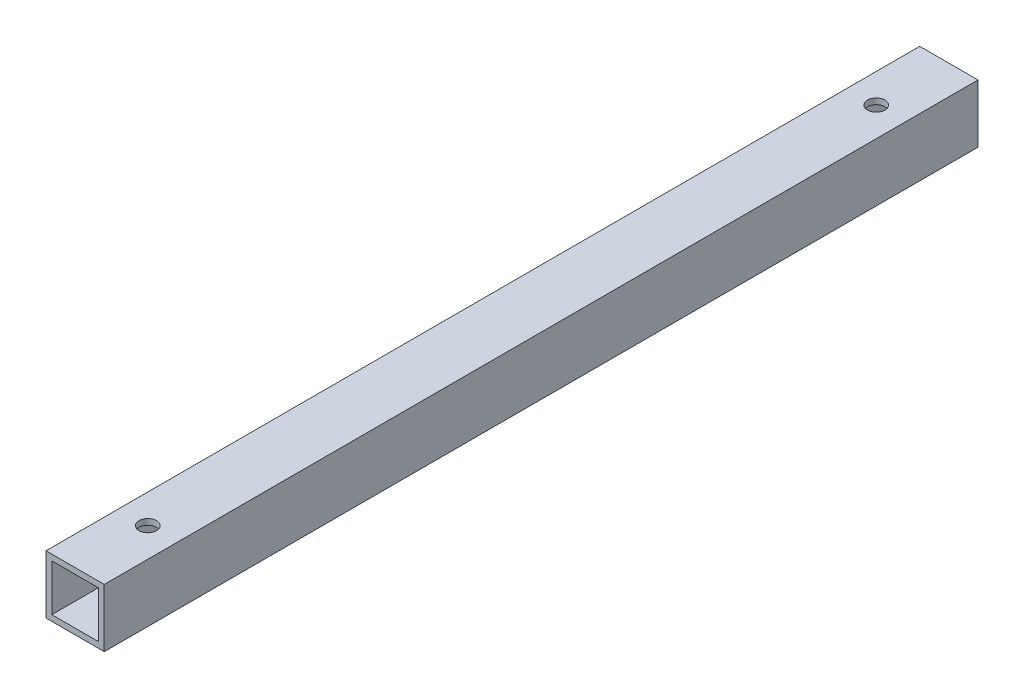
ISO-10303-21;
HEADER;
FILE_DESCRIPTION(('STEP AP214'),'2;1');
FILE_NAME('part.step','',(''),(''),'','','');
FILE_SCHEMA(('AUTOMOTIVE_DESIGN { 1 0 10303 214 1 1 1 1 }'));
ENDSEC;
DATA;
#1=APPLICATION_CONTEXT('core data for automotive mechanical design processes');
#2=APPLICATION_PROTOCOL_DEFINITION('international standard','automotive_design',2000,#1);
#3=PRODUCT_CONTEXT('',#1,'mechanical');
#4=PRODUCT('Part','Part','',(#3));
#5=PRODUCT_RELATED_PRODUCT_CATEGORY('part','',(#4));
#6=PRODUCT_DEFINITION_FORMATION('','',#4);
#7=PRODUCT_DEFINITION_CONTEXT('part definition',#1,'design');
#8=PRODUCT_DEFINITION('design','',#6,#7);
#9=PRODUCT_DEFINITION_SHAPE('','',#8);
#10=(LENGTH_UNIT() NAMED_UNIT(*) SI_UNIT(.MILLI.,.METRE.));
#11=(NAMED_UNIT(*) PLANE_ANGLE_UNIT() SI_UNIT($,.RADIAN.));
#12=(NAMED_UNIT(*) SI_UNIT($,.STERADIAN.) SOLID_ANGLE_UNIT());
#13=UNCERTAINTY_MEASURE_WITH_UNIT(LENGTH_MEASURE(1.E-05),#10,'distance_accuracy_value','');
#14=(GEOMETRIC_REPRESENTATION_CONTEXT(3) GLOBAL_UNCERTAINTY_ASSIGNED_CONTEXT((#13)) GLOBAL_UNIT_ASSIGNED_CONTEXT((#10,
#11,#12)) REPRESENTATION_CONTEXT('',''));
#15=CARTESIAN_POINT('',(0.,0.,0.));
#16=DIRECTION('',(0.,0.,1.));
#17=DIRECTION('',(1.,0.,0.));
#18=AXIS2_PLACEMENT_3D('',#15,#16,#17);
#19=CARTESIAN_POINT('',(0.,0.,75.));
#20=DIRECTION('',(0.,0.,-1.));
#21=DIRECTION('',(-1.,0.,0.));
#22=AXIS2_PLACEMENT_3D('',#19,#20,#21);
#23=PLANE('',#22);
#24=DIRECTION('',(0.,-1.,0.));
#25=VECTOR('',#24,1.);
#26=CARTESIAN_POINT('',(-5.,5.,75.));
#27=LINE('',#26,#25);
#28=CARTESIAN_POINT('',(-5.,5.,75.));
#29=VERTEX_POINT('',#28);
#30=CARTESIAN_POINT('',(-5.,-5.,75.));
#31=VERTEX_POINT('',#30);
#32=EDGE_CURVE('E139',#29,#31,#27,.T.);
#33=ORIENTED_EDGE('',*,*,#32,.T.);
#34=DIRECTION('',(1.,0.,0.));
#35=VECTOR('',#34,1.);
#36=CARTESIAN_POINT('',(5.,-5.,75.));
#37=LINE('',#36,#35);
#38=CARTESIAN_POINT('',(5.,-5.,75.));
#39=VERTEX_POINT('',#38);
#40=EDGE_CURVE('E142',#31,#39,#37,.T.);
#41=ORIENTED_EDGE('',*,*,#40,.T.);
#42=DIRECTION('',(0.,1.,0.));
#43=VECTOR('',#42,1.);
#44=CARTESIAN_POINT('',(5.,5.,75.));
#45=LINE('',#44,#43);
#46=CARTESIAN_POINT('',(5.,5.,75.));
#47=VERTEX_POINT('',#46);
#48=EDGE_CURVE('E145',#39,#47,#45,.T.);
#49=ORIENTED_EDGE('',*,*,#48,.T.);
#50=DIRECTION('',(-1.,0.,0.));
#51=VECTOR('',#50,1.);
#52=CARTESIAN_POINT('',(5.,5.,75.));
#53=LINE('',#52,#51);
#54=EDGE_CURVE('E147',#47,#29,#53,.T.);
#55=ORIENTED_EDGE('',*,*,#54,.T.);
#56=EDGE_LOOP('',(#33,#41,#49,#55));
#57=FACE_BOUND('',#56,.T.);
#58=DIRECTION('',(0.,-1.,0.));
#59=VECTOR('',#58,1.);
#60=CARTESIAN_POINT('',(-4.,4.,75.));
#61=LINE('',#60,#59);
#62=CARTESIAN_POINT('',(-4.,4.,75.));
#63=VERTEX_POINT('',#62);
#64=CARTESIAN_POINT('',(-4.,-4.,75.));
#65=VERTEX_POINT('',#64);
#66=EDGE_CURVE('E101',#63,#65,#61,.T.);
#67=ORIENTED_EDGE('',*,*,#66,.F.);
#68=DIRECTION('',(-1.,0.,0.));
#69=VECTOR('',#68,1.);
#70=CARTESIAN_POINT('',(4.,4.,75.));
#71=LINE('',#70,#69);
#72=CARTESIAN_POINT('',(4.,4.,75.));
#73=VERTEX_POINT('',#72);
#74=EDGE_CURVE('E123',#73,#63,#71,.T.);
#75=ORIENTED_EDGE('',*,*,#74,.F.);
#76=DIRECTION('',(0.,1.,0.));
#77=VECTOR('',#76,1.);
#78=CARTESIAN_POINT('',(4.,4.,75.));
#79=LINE('',#78,#77);
#80=CARTESIAN_POINT('',(4.,-4.,75.));
#81=VERTEX_POINT('',#80);
#82=EDGE_CURVE('E121',#81,#73,#79,.T.);
#83=ORIENTED_EDGE('',*,*,#82,.F.);
#84=DIRECTION('',(1.,0.,0.));
#85=VECTOR('',#84,1.);
#86=CARTESIAN_POINT('',(4.,-4.,75.));
#87=LINE('',#86,#85);
#88=EDGE_CURVE('E109',#65,#81,#87,.T.);
#89=ORIENTED_EDGE('',*,*,#88,.F.);
#90=EDGE_LOOP('',(#67,#75,#83,#89));
#91=FACE_BOUND('',#90,.T.);
#92=ADVANCED_FACE('F35',(#57,#91),#23,.F.);
#93=CARTESIAN_POINT('',(0.,0.,-75.));
#94=DIRECTION('',(0.,0.,-1.));
#95=DIRECTION('',(-1.,0.,0.));
#96=AXIS2_PLACEMENT_3D('',#93,#94,#95);
#97=PLANE('',#96);
#98=DIRECTION('',(0.,-1.,0.));
#99=VECTOR('',#98,1.);
#100=CARTESIAN_POINT('',(-5.,5.,-75.));
#101=LINE('',#100,#99);
#102=CARTESIAN_POINT('',(-5.,5.,-75.));
#103=VERTEX_POINT('',#102);
#104=CARTESIAN_POINT('',(-5.,-5.,-75.));
#105=VERTEX_POINT('',#104);
#106=EDGE_CURVE('E117',#103,#105,#101,.T.);
#107=ORIENTED_EDGE('',*,*,#106,.F.);
#108=DIRECTION('',(-1.,0.,0.));
#109=VECTOR('',#108,1.);
#110=CARTESIAN_POINT('',(5.,5.,-75.));
#111=LINE('',#110,#109);
#112=CARTESIAN_POINT('',(5.,5.,-75.));
#113=VERTEX_POINT('',#112);
#114=EDGE_CURVE('E143',#113,#103,#111,.T.);
#115=ORIENTED_EDGE('',*,*,#114,.F.);
#116=DIRECTION('',(0.,1.,0.));
#117=VECTOR('',#116,1.);
#118=CARTESIAN_POINT('',(5.,5.,-75.));
#119=LINE('',#118,#117);
#120=CARTESIAN_POINT('',(5.,-5.,-75.));
#121=VERTEX_POINT('',#120);
#122=EDGE_CURVE('E154',#121,#113,#119,.T.);
#123=ORIENTED_EDGE('',*,*,#122,.F.);
#124=DIRECTION('',(1.,0.,0.));
#125=VECTOR('',#124,1.);
#126=CARTESIAN_POINT('',(5.,-5.,-75.));
#127=LINE('',#126,#125);
#128=EDGE_CURVE('E152',#105,#121,#127,.T.);
#129=ORIENTED_EDGE('',*,*,#128,.F.);
#130=EDGE_LOOP('',(#107,#115,#123,#129));
#131=FACE_BOUND('',#130,.T.);
#132=DIRECTION('',(-1.,0.,0.));
#133=VECTOR('',#132,1.);
#134=CARTESIAN_POINT('',(4.,4.,-75.));
#135=LINE('',#134,#133);
#136=CARTESIAN_POINT('',(4.,4.,-75.));
#137=VERTEX_POINT('',#136);
#138=CARTESIAN_POINT('',(-4.,4.,-75.));
#139=VERTEX_POINT('',#138);
#140=EDGE_CURVE('E110',#137,#139,#135,.T.);
#141=ORIENTED_EDGE('',*,*,#140,.T.);
#142=DIRECTION('',(0.,-1.,0.));
#143=VECTOR('',#142,1.);
#144=CARTESIAN_POINT('',(-4.,4.,-75.));
#145=LINE('',#144,#143);
#146=CARTESIAN_POINT('',(-4.,-4.,-75.));
#147=VERTEX_POINT('',#146);
#148=EDGE_CURVE('E59',#139,#147,#145,.T.);
#149=ORIENTED_EDGE('',*,*,#148,.T.);
#150=DIRECTION('',(1.,0.,0.));
#151=VECTOR('',#150,1.);
#152=CARTESIAN_POINT('',(4.,-4.,-75.));
#153=LINE('',#152,#151);
#154=CARTESIAN_POINT('',(4.,-4.,-75.));
#155=VERTEX_POINT('',#154);
#156=EDGE_CURVE('E116',#147,#155,#153,.T.);
#157=ORIENTED_EDGE('',*,*,#156,.T.);
#158=DIRECTION('',(0.,1.,0.));
#159=VECTOR('',#158,1.);
#160=CARTESIAN_POINT('',(4.,4.,-75.));
#161=LINE('',#160,#159);
#162=EDGE_CURVE('E131',#155,#137,#161,.T.);
#163=ORIENTED_EDGE('',*,*,#162,.T.);
#164=EDGE_LOOP('',(#141,#149,#157,#163));
#165=FACE_BOUND('',#164,.T.);
#166=ADVANCED_FACE('F173',(#131,#165),#97,.T.);
#167=CARTESIAN_POINT('',(-5.,5.,75.));
#168=DIRECTION('',(1.,0.,0.));
#169=DIRECTION('',(0.,0.,-1.));
#170=AXIS2_PLACEMENT_3D('',#167,#168,#169);
#171=PLANE('',#170);
#172=ORIENTED_EDGE('',*,*,#106,.T.);
#173=DIRECTION('',(0.,0.,-1.));
#174=VECTOR('',#173,1.);
#175=CARTESIAN_POINT('',(-5.,-5.,75.));
#176=LINE('',#175,#174);
#177=EDGE_CURVE('E11',#31,#105,#176,.T.);
#178=ORIENTED_EDGE('',*,*,#177,.F.);
#179=ORIENTED_EDGE('',*,*,#32,.F.);
#180=DIRECTION('',(0.,0.,-1.));
#181=VECTOR('',#180,1.);
#182=CARTESIAN_POINT('',(-5.,5.,75.));
#183=LINE('',#182,#181);
#184=EDGE_CURVE('E149',#29,#103,#183,.T.);
#185=ORIENTED_EDGE('',*,*,#184,.T.);
#186=EDGE_LOOP('',(#172,#178,#179,#185));
#187=FACE_BOUND('',#186,.T.);
#188=ADVANCED_FACE('F37',(#187),#171,.F.);
#189=CARTESIAN_POINT('',(5.,-5.,75.));
#190=DIRECTION('',(0.,1.,0.));
#191=DIRECTION('',(0.,0.,1.));
#192=AXIS2_PLACEMENT_3D('',#189,#190,#191);
#193=PLANE('',#192);
#194=CARTESIAN_POINT('',(0.00163858329448041,-5.,62.5223109153456));
#195=DIRECTION('',(0.,-1.,0.));
#196=DIRECTION('',(0.,0.,-1.));
#197=AXIS2_PLACEMENT_3D('',#194,#195,#196);
#198=CIRCLE('',#197,1.50000000000001);
#199=CARTESIAN_POINT('',(0.00163858329448041,-5.,61.0223109153456));
#200=VERTEX_POINT('',#199);
#201=EDGE_CURVE('E260',#200,#200,#198,.T.);
#202=ORIENTED_EDGE('',*,*,#201,.F.);
#203=EDGE_LOOP('',(#202));
#204=FACE_BOUND('',#203,.T.);
#205=CARTESIAN_POINT('',(0.00163858327670297,-5.,-62.5295779221826));
#206=DIRECTION('',(0.,-1.,0.));
#207=DIRECTION('',(0.,0.,-1.));
#208=AXIS2_PLACEMENT_3D('',#205,#206,#207);
#209=CIRCLE('',#208,1.50000000000001);
#210=CARTESIAN_POINT('',(0.00163858327670297,-5.,-64.0295779221826));
#211=VERTEX_POINT('',#210);
#212=EDGE_CURVE('E218',#211,#211,#209,.T.);
#213=ORIENTED_EDGE('',*,*,#212,.F.);
#214=EDGE_LOOP('',(#213));
#215=FACE_BOUND('',#214,.T.);
#216=ORIENTED_EDGE('',*,*,#128,.T.);
#217=DIRECTION('',(0.,0.,-1.));
#218=VECTOR('',#217,1.);
#219=CARTESIAN_POINT('',(5.,-5.,75.));
#220=LINE('',#219,#218);
#221=EDGE_CURVE('E44',#39,#121,#220,.T.);
#222=ORIENTED_EDGE('',*,*,#221,.F.);
#223=ORIENTED_EDGE('',*,*,#40,.F.);
#224=ORIENTED_EDGE('',*,*,#177,.T.);
#225=EDGE_LOOP('',(#216,#222,#223,#224));
#226=FACE_BOUND('',#225,.T.);
#227=ADVANCED_FACE('F183',(#204,#215,#226),#193,.F.);
#228=CARTESIAN_POINT('',(5.,5.,75.));
#229=DIRECTION('',(-1.,0.,0.));
#230=DIRECTION('',(0.,0.,1.));
#231=AXIS2_PLACEMENT_3D('',#228,#229,#230);
#232=PLANE('',#231);
#233=ORIENTED_EDGE('',*,*,#122,.T.);
#234=DIRECTION('',(0.,0.,-1.));
#235=VECTOR('',#234,1.);
#236=CARTESIAN_POINT('',(5.,5.,75.));
#237=LINE('',#236,#235);
#238=EDGE_CURVE('E159',#47,#113,#237,.T.);
#239=ORIENTED_EDGE('',*,*,#238,.F.);
#240=ORIENTED_EDGE('',*,*,#48,.F.);
#241=ORIENTED_EDGE('',*,*,#221,.T.);
#242=EDGE_LOOP('',(#233,#239,#240,#241));
#243=FACE_BOUND('',#242,.T.);
#244=ADVANCED_FACE('F167',(#243),#232,.F.);
#245=CARTESIAN_POINT('',(5.,5.,75.));
#246=DIRECTION('',(0.,-1.,0.));
#247=DIRECTION('',(1.,0.,0.));
#248=AXIS2_PLACEMENT_3D('',#245,#246,#247);
#249=PLANE('',#248);
#250=CARTESIAN_POINT('',(0.00163858329448041,5.,62.5223109153456));
#251=DIRECTION('',(0.,-1.,0.));
#252=DIRECTION('',(0.,0.,-1.));
#253=AXIS2_PLACEMENT_3D('',#250,#251,#252);
#254=CIRCLE('',#253,1.50000000000001);
#255=CARTESIAN_POINT('',(0.00163858329448041,5.,61.0223109153456));
#256=VERTEX_POINT('',#255);
#257=EDGE_CURVE('E212',#256,#256,#254,.T.);
#258=ORIENTED_EDGE('',*,*,#257,.T.);
#259=EDGE_LOOP('',(#258));
#260=FACE_BOUND('',#259,.T.);
#261=CARTESIAN_POINT('',(0.00163858327670297,5.,-62.5295779221826));
#262=DIRECTION('',(0.,-1.,0.));
#263=DIRECTION('',(0.,0.,-1.));
#264=AXIS2_PLACEMENT_3D('',#261,#262,#263);
#265=CIRCLE('',#264,1.50000000000001);
#266=CARTESIAN_POINT('',(0.00163858327670297,5.,-64.0295779221826));
#267=VERTEX_POINT('',#266);
#268=EDGE_CURVE('E215',#267,#267,#265,.T.);
#269=ORIENTED_EDGE('',*,*,#268,.T.);
#270=EDGE_LOOP('',(#269));
#271=FACE_BOUND('',#270,.T.);
#272=ORIENTED_EDGE('',*,*,#114,.T.);
#273=ORIENTED_EDGE('',*,*,#184,.F.);
#274=ORIENTED_EDGE('',*,*,#54,.F.);
#275=ORIENTED_EDGE('',*,*,#238,.T.);
#276=EDGE_LOOP('',(#272,#273,#274,#275));
#277=FACE_BOUND('',#276,.T.);
#278=ADVANCED_FACE('F177',(#260,#271,#277),#249,.F.);
#279=CARTESIAN_POINT('',(-4.,4.,75.));
#280=DIRECTION('',(1.,0.,0.));
#281=DIRECTION('',(0.,0.,-1.));
#282=AXIS2_PLACEMENT_3D('',#279,#280,#281);
#283=PLANE('',#282);
#284=ORIENTED_EDGE('',*,*,#148,.F.);
#285=DIRECTION('',(0.,0.,-1.));
#286=VECTOR('',#285,1.);
#287=CARTESIAN_POINT('',(-4.,4.,75.));
#288=LINE('',#287,#286);
#289=EDGE_CURVE('E105',#63,#139,#288,.T.);
#290=ORIENTED_EDGE('',*,*,#289,.F.);
#291=ORIENTED_EDGE('',*,*,#66,.T.);
#292=DIRECTION('',(0.,0.,-1.));
#293=VECTOR('',#292,1.);
#294=CARTESIAN_POINT('',(-4.,-4.,75.));
#295=LINE('',#294,#293);
#296=EDGE_CURVE('E104',#65,#147,#295,.T.);
#297=ORIENTED_EDGE('',*,*,#296,.T.);
#298=EDGE_LOOP('',(#284,#290,#291,#297));
#299=FACE_BOUND('',#298,.T.);
#300=ADVANCED_FACE('F103',(#299),#283,.T.);
#301=CARTESIAN_POINT('',(4.,-4.,75.));
#302=DIRECTION('',(0.,1.,0.));
#303=DIRECTION('',(0.,0.,1.));
#304=AXIS2_PLACEMENT_3D('',#301,#302,#303);
#305=PLANE('',#304);
#306=CARTESIAN_POINT('',(0.00163858329448041,-4.,62.5223109153456));
#307=DIRECTION('',(0.,1.,0.));
#308=DIRECTION('',(0.,0.,1.));
#309=AXIS2_PLACEMENT_3D('',#306,#307,#308);
#310=CIRCLE('',#309,1.50000000000001);
#311=CARTESIAN_POINT('',(0.00163858329448041,-4.,64.0223109153457));
#312=VERTEX_POINT('',#311);
#313=EDGE_CURVE('E39',#312,#312,#310,.T.);
#314=ORIENTED_EDGE('',*,*,#313,.F.);
#315=EDGE_LOOP('',(#314));
#316=FACE_BOUND('',#315,.T.);
#317=CARTESIAN_POINT('',(0.00163858327670297,-4.,-62.5295779221826));
#318=DIRECTION('',(0.,1.,0.));
#319=DIRECTION('',(0.,0.,1.));
#320=AXIS2_PLACEMENT_3D('',#317,#318,#319);
#321=CIRCLE('',#320,1.50000000000001);
#322=CARTESIAN_POINT('',(0.00163858327670297,-4.,-61.0295779221825));
#323=VERTEX_POINT('',#322);
#324=EDGE_CURVE('E129',#323,#323,#321,.T.);
#325=ORIENTED_EDGE('',*,*,#324,.F.);
#326=EDGE_LOOP('',(#325));
#327=FACE_BOUND('',#326,.T.);
#328=ORIENTED_EDGE('',*,*,#156,.F.);
#329=ORIENTED_EDGE('',*,*,#296,.F.);
#330=ORIENTED_EDGE('',*,*,#88,.T.);
#331=DIRECTION('',(0.,0.,-1.));
#332=VECTOR('',#331,1.);
#333=CARTESIAN_POINT('',(4.,-4.,75.));
#334=LINE('',#333,#332);
#335=EDGE_CURVE('E118',#81,#155,#334,.T.);
#336=ORIENTED_EDGE('',*,*,#335,.T.);
#337=EDGE_LOOP('',(#328,#329,#330,#336));
#338=FACE_BOUND('',#337,.T.);
#339=ADVANCED_FACE('F113',(#316,#327,#338),#305,.T.);
#340=CARTESIAN_POINT('',(4.,4.,75.));
#341=DIRECTION('',(-1.,0.,0.));
#342=DIRECTION('',(0.,0.,1.));
#343=AXIS2_PLACEMENT_3D('',#340,#341,#342);
#344=PLANE('',#343);
#345=ORIENTED_EDGE('',*,*,#162,.F.);
#346=ORIENTED_EDGE('',*,*,#335,.F.);
#347=ORIENTED_EDGE('',*,*,#82,.T.);
#348=DIRECTION('',(0.,0.,-1.));
#349=VECTOR('',#348,1.);
#350=CARTESIAN_POINT('',(4.,4.,75.));
#351=LINE('',#350,#349);
#352=EDGE_CURVE('E51',#73,#137,#351,.T.);
#353=ORIENTED_EDGE('',*,*,#352,.T.);
#354=EDGE_LOOP('',(#345,#346,#347,#353));
#355=FACE_BOUND('',#354,.T.);
#356=ADVANCED_FACE('F232',(#355),#344,.T.);
#357=CARTESIAN_POINT('',(4.,4.,75.));
#358=DIRECTION('',(0.,-1.,0.));
#359=DIRECTION('',(0.,0.,-1.));
#360=AXIS2_PLACEMENT_3D('',#357,#358,#359);
#361=PLANE('',#360);
#362=CARTESIAN_POINT('',(0.00163858329448041,4.,62.5223109153456));
#363=DIRECTION('',(0.,-1.,0.));
#364=DIRECTION('',(0.,0.,-1.));
#365=AXIS2_PLACEMENT_3D('',#362,#363,#364);
#366=CIRCLE('',#365,1.50000000000001);
#367=CARTESIAN_POINT('',(0.00163858329448041,4.,61.0223109153456));
#368=VERTEX_POINT('',#367);
#369=EDGE_CURVE('E223',#368,#368,#366,.T.);
#370=ORIENTED_EDGE('',*,*,#369,.F.);
#371=EDGE_LOOP('',(#370));
#372=FACE_BOUND('',#371,.T.);
#373=CARTESIAN_POINT('',(0.00163858327670297,4.,-62.5295779221826));
#374=DIRECTION('',(0.,-1.,0.));
#375=DIRECTION('',(0.,0.,-1.));
#376=AXIS2_PLACEMENT_3D('',#373,#374,#375);
#377=CIRCLE('',#376,1.50000000000001);
#378=CARTESIAN_POINT('',(0.00163858327670297,4.,-64.0295779221826));
#379=VERTEX_POINT('',#378);
#380=EDGE_CURVE('E217',#379,#379,#377,.T.);
#381=ORIENTED_EDGE('',*,*,#380,.F.);
#382=EDGE_LOOP('',(#381));
#383=FACE_BOUND('',#382,.T.);
#384=ORIENTED_EDGE('',*,*,#140,.F.);
#385=ORIENTED_EDGE('',*,*,#352,.F.);
#386=ORIENTED_EDGE('',*,*,#74,.T.);
#387=ORIENTED_EDGE('',*,*,#289,.T.);
#388=EDGE_LOOP('',(#384,#385,#386,#387));
#389=FACE_BOUND('',#388,.T.);
#390=ADVANCED_FACE('F238',(#372,#383,#389),#361,.T.);
#391=CARTESIAN_POINT('',(0.00163858327670297,-5.,-62.5295779221826));
#392=DIRECTION('',(0.,-1.,0.));
#393=DIRECTION('',(0.,0.,-1.));
#394=AXIS2_PLACEMENT_3D('',#391,#392,#393);
#395=CYLINDRICAL_SURFACE('',#394,1.50000000000001);
#396=ORIENTED_EDGE('',*,*,#324,.T.);
#397=EDGE_LOOP('',(#396));
#398=FACE_BOUND('',#397,.T.);
#399=ORIENTED_EDGE('',*,*,#212,.T.);
#400=EDGE_LOOP('',(#399));
#401=FACE_BOUND('',#400,.T.);
#402=ADVANCED_FACE('F229',(#398,#401),#395,.F.);
#403=ORIENTED_EDGE('',*,*,#380,.T.);
#404=EDGE_LOOP('',(#403));
#405=FACE_BOUND('',#404,.T.);
#406=ORIENTED_EDGE('',*,*,#268,.F.);
#407=EDGE_LOOP('',(#406));
#408=FACE_BOUND('',#407,.T.);
#409=ADVANCED_FACE('F245',(#405,#408),#395,.F.);
#410=CARTESIAN_POINT('',(0.00163858329448041,-5.,62.5223109153456));
#411=DIRECTION('',(0.,-1.,0.));
#412=DIRECTION('',(0.,0.,-1.));
#413=AXIS2_PLACEMENT_3D('',#410,#411,#412);
#414=CYLINDRICAL_SURFACE('',#413,1.50000000000001);
#415=ORIENTED_EDGE('',*,*,#313,.T.);
#416=EDGE_LOOP('',(#415));
#417=FACE_BOUND('',#416,.T.);
#418=ORIENTED_EDGE('',*,*,#201,.T.);
#419=EDGE_LOOP('',(#418));
#420=FACE_BOUND('',#419,.T.);
#421=ADVANCED_FACE('F248',(#417,#420),#414,.F.);
#422=ORIENTED_EDGE('',*,*,#369,.T.);
#423=EDGE_LOOP('',(#422));
#424=FACE_BOUND('',#423,.T.);
#425=ORIENTED_EDGE('',*,*,#257,.F.);
#426=EDGE_LOOP('',(#425));
#427=FACE_BOUND('',#426,.T.);
#428=ADVANCED_FACE('F251',(#424,#427),#414,.F.);
#429=CLOSED_SHELL('',(#92,#166,#188,#227,#244,#278,#300,#339,#356,#390,#402,#409,#421,#428));
#430=MANIFOLD_SOLID_BREP('B2',#429);
#431=ADVANCED_BREP_SHAPE_REPRESENTATION('',(#18,#430),#14);
#432=SHAPE_DEFINITION_REPRESENTATION(#9,#431);
ENDSEC;
END-ISO-10303-21;
